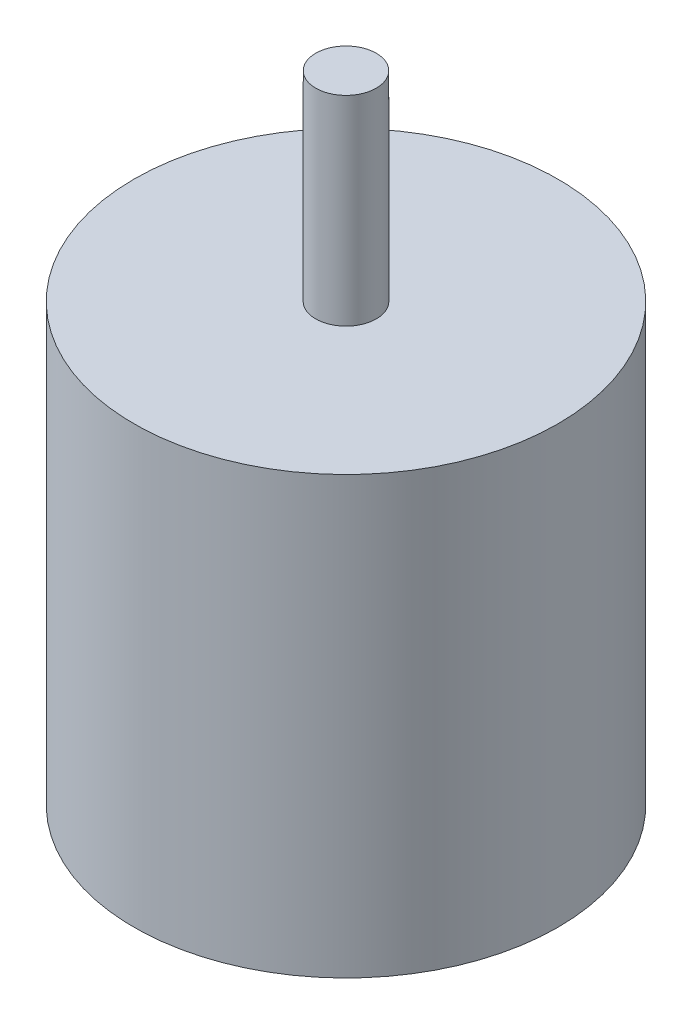
ISO-10303-21;
HEADER;
FILE_DESCRIPTION(('STEP AP214'),'2;1');
FILE_NAME('part.step','',(''),(''),'','','');
FILE_SCHEMA(('AUTOMOTIVE_DESIGN { 1 0 10303 214 1 1 1 1 }'));
ENDSEC;
DATA;
#1=APPLICATION_CONTEXT('core data for automotive mechanical design processes');
#2=APPLICATION_PROTOCOL_DEFINITION('international standard','automotive_design',2000,#1);
#3=PRODUCT_CONTEXT('',#1,'mechanical');
#4=PRODUCT('Part','Part','',(#3));
#5=PRODUCT_RELATED_PRODUCT_CATEGORY('part','',(#4));
#6=PRODUCT_DEFINITION_FORMATION('','',#4);
#7=PRODUCT_DEFINITION_CONTEXT('part definition',#1,'design');
#8=PRODUCT_DEFINITION('design','',#6,#7);
#9=PRODUCT_DEFINITION_SHAPE('','',#8);
#10=(LENGTH_UNIT() NAMED_UNIT(*) SI_UNIT(.MILLI.,.METRE.));
#11=(NAMED_UNIT(*) PLANE_ANGLE_UNIT() SI_UNIT($,.RADIAN.));
#12=(NAMED_UNIT(*) SI_UNIT($,.STERADIAN.) SOLID_ANGLE_UNIT());
#13=UNCERTAINTY_MEASURE_WITH_UNIT(LENGTH_MEASURE(1.E-05),#10,'distance_accuracy_value','');
#14=(GEOMETRIC_REPRESENTATION_CONTEXT(3) GLOBAL_UNCERTAINTY_ASSIGNED_CONTEXT((#13)) GLOBAL_UNIT_ASSIGNED_CONTEXT((#10,
#11,#12)) REPRESENTATION_CONTEXT('',''));
#15=CARTESIAN_POINT('',(0.,0.,0.));
#16=DIRECTION('',(0.,0.,1.));
#17=DIRECTION('',(1.,0.,0.));
#18=AXIS2_PLACEMENT_3D('',#15,#16,#17);
#19=CARTESIAN_POINT('',(0.,18.,0.));
#20=DIRECTION('',(0.,1.,0.));
#21=DIRECTION('',(-1.,0.,0.));
#22=AXIS2_PLACEMENT_3D('',#19,#20,#21);
#23=CYLINDRICAL_SURFACE('',#22,17.5);
#24=CARTESIAN_POINT('',(0.,18.,0.));
#25=DIRECTION('',(0.,1.,0.));
#26=DIRECTION('',(-1.,0.,0.));
#27=AXIS2_PLACEMENT_3D('',#24,#25,#26);
#28=CIRCLE('',#27,17.5);
#29=CARTESIAN_POINT('',(-17.5,18.,0.));
#30=VERTEX_POINT('',#29);
#31=EDGE_CURVE('E50',#30,#30,#28,.T.);
#32=ORIENTED_EDGE('',*,*,#31,.F.);
#33=EDGE_LOOP('',(#32));
#34=FACE_BOUND('',#33,.T.);
#35=CARTESIAN_POINT('',(0.,-18.,0.));
#36=DIRECTION('',(0.,1.,0.));
#37=DIRECTION('',(-1.,0.,0.));
#38=AXIS2_PLACEMENT_3D('',#35,#36,#37);
#39=CIRCLE('',#38,17.5);
#40=CARTESIAN_POINT('',(-17.5,-18.,0.));
#41=VERTEX_POINT('',#40);
#42=EDGE_CURVE('E55',#41,#41,#39,.T.);
#43=ORIENTED_EDGE('',*,*,#42,.T.);
#44=EDGE_LOOP('',(#43));
#45=FACE_BOUND('',#44,.T.);
#46=ADVANCED_FACE('F43',(#34,#45),#23,.T.);
#47=CARTESIAN_POINT('',(0.,18.,0.));
#48=DIRECTION('',(0.,-1.,0.));
#49=DIRECTION('',(1.,0.,0.));
#50=AXIS2_PLACEMENT_3D('',#47,#48,#49);
#51=PLANE('',#50);
#52=CARTESIAN_POINT('',(0.,18.,0.));
#53=DIRECTION('',(0.,-1.,0.));
#54=DIRECTION('',(1.,0.,0.));
#55=AXIS2_PLACEMENT_3D('',#52,#53,#54);
#56=CIRCLE('',#55,2.5);
#57=CARTESIAN_POINT('',(2.49999999999999,18.,0.));
#58=VERTEX_POINT('',#57);
#59=EDGE_CURVE('E10',#58,#58,#56,.F.);
#60=ORIENTED_EDGE('',*,*,#59,.F.);
#61=EDGE_LOOP('',(#60));
#62=FACE_BOUND('',#61,.T.);
#63=ORIENTED_EDGE('',*,*,#31,.T.);
#64=EDGE_LOOP('',(#63));
#65=FACE_BOUND('',#64,.T.);
#66=ADVANCED_FACE('F137',(#62,#65),#51,.F.);
#67=CARTESIAN_POINT('',(0.,-18.,0.));
#68=DIRECTION('',(0.,1.,0.));
#69=DIRECTION('',(-1.,0.,0.));
#70=AXIS2_PLACEMENT_3D('',#67,#68,#69);
#71=PLANE('',#70);
#72=CARTESIAN_POINT('',(0.,-18.,-9.5));
#73=DIRECTION('',(0.,-1.,0.));
#74=DIRECTION('',(1.,0.,0.));
#75=AXIS2_PLACEMENT_3D('',#72,#73,#74);
#76=CIRCLE('',#75,1.5);
#77=CARTESIAN_POINT('',(1.50000000000001,-18.,-9.5));
#78=VERTEX_POINT('',#77);
#79=EDGE_CURVE('E71',#78,#78,#76,.T.);
#80=ORIENTED_EDGE('',*,*,#79,.F.);
#81=EDGE_LOOP('',(#80));
#82=FACE_BOUND('',#81,.T.);
#83=CARTESIAN_POINT('',(12.5,-18.,0.));
#84=DIRECTION('',(0.,-1.,0.));
#85=DIRECTION('',(1.,0.,0.));
#86=AXIS2_PLACEMENT_3D('',#83,#84,#85);
#87=CIRCLE('',#86,1.5);
#88=CARTESIAN_POINT('',(14.,-18.,0.));
#89=VERTEX_POINT('',#88);
#90=EDGE_CURVE('E96',#89,#89,#87,.T.);
#91=ORIENTED_EDGE('',*,*,#90,.F.);
#92=EDGE_LOOP('',(#91));
#93=FACE_BOUND('',#92,.T.);
#94=CARTESIAN_POINT('',(-12.5,-18.,0.));
#95=DIRECTION('',(0.,-1.,0.));
#96=DIRECTION('',(1.,0.,0.));
#97=AXIS2_PLACEMENT_3D('',#94,#95,#96);
#98=CIRCLE('',#97,1.5);
#99=CARTESIAN_POINT('',(-11.,-18.,0.));
#100=VERTEX_POINT('',#99);
#101=EDGE_CURVE('E88',#100,#100,#98,.T.);
#102=ORIENTED_EDGE('',*,*,#101,.F.);
#103=EDGE_LOOP('',(#102));
#104=FACE_BOUND('',#103,.T.);
#105=CARTESIAN_POINT('',(-8.83883476483184,-18.,8.83883476483184));
#106=DIRECTION('',(0.,-1.,0.));
#107=DIRECTION('',(1.,0.,0.));
#108=AXIS2_PLACEMENT_3D('',#105,#106,#107);
#109=CIRCLE('',#108,4.);
#110=CARTESIAN_POINT('',(-4.83883476483184,-18.,8.83883476483184));
#111=VERTEX_POINT('',#110);
#112=EDGE_CURVE('E79',#111,#111,#109,.T.);
#113=ORIENTED_EDGE('',*,*,#112,.F.);
#114=EDGE_LOOP('',(#113));
#115=FACE_BOUND('',#114,.T.);
#116=CARTESIAN_POINT('',(8.83883476483185,-18.,-8.83883476483184));
#117=DIRECTION('',(0.,-1.,0.));
#118=DIRECTION('',(1.,0.,0.));
#119=AXIS2_PLACEMENT_3D('',#116,#117,#118);
#120=CIRCLE('',#119,4.);
#121=CARTESIAN_POINT('',(12.8388347648319,-18.,-8.83883476483184));
#122=VERTEX_POINT('',#121);
#123=EDGE_CURVE('E80',#122,#122,#120,.T.);
#124=ORIENTED_EDGE('',*,*,#123,.F.);
#125=EDGE_LOOP('',(#124));
#126=FACE_BOUND('',#125,.T.);
#127=CARTESIAN_POINT('',(-8.83883476483184,-18.,-8.83883476483184));
#128=DIRECTION('',(0.,-1.,0.));
#129=DIRECTION('',(1.,0.,0.));
#130=AXIS2_PLACEMENT_3D('',#127,#128,#129);
#131=CIRCLE('',#130,4.);
#132=CARTESIAN_POINT('',(-4.83883476483184,-18.,-8.83883476483184));
#133=VERTEX_POINT('',#132);
#134=EDGE_CURVE('E119',#133,#133,#131,.T.);
#135=ORIENTED_EDGE('',*,*,#134,.F.);
#136=EDGE_LOOP('',(#135));
#137=FACE_BOUND('',#136,.T.);
#138=CARTESIAN_POINT('',(8.83883476483185,-18.,8.83883476483184));
#139=DIRECTION('',(0.,-1.,0.));
#140=DIRECTION('',(1.,0.,0.));
#141=AXIS2_PLACEMENT_3D('',#138,#139,#140);
#142=CIRCLE('',#141,4.);
#143=CARTESIAN_POINT('',(12.8388347648319,-18.,8.83883476483184));
#144=VERTEX_POINT('',#143);
#145=EDGE_CURVE('E111',#144,#144,#142,.T.);
#146=ORIENTED_EDGE('',*,*,#145,.F.);
#147=EDGE_LOOP('',(#146));
#148=FACE_BOUND('',#147,.T.);
#149=CARTESIAN_POINT('',(0.,-18.,9.5));
#150=DIRECTION('',(0.,-1.,0.));
#151=DIRECTION('',(1.,0.,0.));
#152=AXIS2_PLACEMENT_3D('',#149,#150,#151);
#153=CIRCLE('',#152,1.5);
#154=CARTESIAN_POINT('',(1.50000000000001,-18.,9.5));
#155=VERTEX_POINT('',#154);
#156=EDGE_CURVE('E67',#155,#155,#153,.T.);
#157=ORIENTED_EDGE('',*,*,#156,.F.);
#158=EDGE_LOOP('',(#157));
#159=FACE_BOUND('',#158,.T.);
#160=ORIENTED_EDGE('',*,*,#42,.F.);
#161=EDGE_LOOP('',(#160));
#162=FACE_BOUND('',#161,.T.);
#163=ADVANCED_FACE('F133',(#82,#93,#104,#115,#126,#137,#148,#159,#162),#71,.F.);
#164=CARTESIAN_POINT('',(0.,34.5,0.));
#165=DIRECTION('',(0.,-1.,0.));
#166=DIRECTION('',(1.,0.,0.));
#167=AXIS2_PLACEMENT_3D('',#164,#165,#166);
#168=CYLINDRICAL_SURFACE('',#167,2.5);
#169=CARTESIAN_POINT('',(0.,34.5,0.));
#170=DIRECTION('',(0.,1.,0.));
#171=DIRECTION('',(-1.,0.,0.));
#172=AXIS2_PLACEMENT_3D('',#169,#170,#171);
#173=CIRCLE('',#172,2.5);
#174=CARTESIAN_POINT('',(-2.50000000000001,34.5,0.));
#175=VERTEX_POINT('',#174);
#176=EDGE_CURVE('E60',#175,#175,#173,.T.);
#177=ORIENTED_EDGE('',*,*,#176,.F.);
#178=EDGE_LOOP('',(#177));
#179=FACE_BOUND('',#178,.T.);
#180=ORIENTED_EDGE('',*,*,#59,.T.);
#181=EDGE_LOOP('',(#180));
#182=FACE_BOUND('',#181,.T.);
#183=ADVANCED_FACE('F136',(#179,#182),#168,.T.);
#184=CARTESIAN_POINT('',(0.,34.5,0.));
#185=DIRECTION('',(0.,1.,0.));
#186=DIRECTION('',(-1.,0.,0.));
#187=AXIS2_PLACEMENT_3D('',#184,#185,#186);
#188=PLANE('',#187);
#189=ORIENTED_EDGE('',*,*,#176,.T.);
#190=EDGE_LOOP('',(#189));
#191=FACE_BOUND('',#190,.T.);
#192=ADVANCED_FACE('F159',(#191),#188,.T.);
#193=CARTESIAN_POINT('',(0.,-13.,9.5));
#194=DIRECTION('',(0.,-1.,0.));
#195=DIRECTION('',(1.,0.,0.));
#196=AXIS2_PLACEMENT_3D('',#193,#194,#195);
#197=CYLINDRICAL_SURFACE('',#196,1.5);
#198=CARTESIAN_POINT('',(0.,-13.,9.5));
#199=DIRECTION('',(0.,-1.,0.));
#200=DIRECTION('',(1.,0.,0.));
#201=AXIS2_PLACEMENT_3D('',#198,#199,#200);
#202=CIRCLE('',#201,1.5);
#203=CARTESIAN_POINT('',(1.5,-13.,9.5));
#204=VERTEX_POINT('',#203);
#205=EDGE_CURVE('E66',#204,#204,#202,.T.);
#206=ORIENTED_EDGE('',*,*,#205,.F.);
#207=EDGE_LOOP('',(#206));
#208=FACE_BOUND('',#207,.T.);
#209=ORIENTED_EDGE('',*,*,#156,.T.);
#210=EDGE_LOOP('',(#209));
#211=FACE_BOUND('',#210,.T.);
#212=ADVANCED_FACE('F163',(#208,#211),#197,.F.);
#213=CARTESIAN_POINT('',(0.,-13.,9.5));
#214=DIRECTION('',(0.,-1.,0.));
#215=DIRECTION('',(1.,0.,0.));
#216=AXIS2_PLACEMENT_3D('',#213,#214,#215);
#217=PLANE('',#216);
#218=ORIENTED_EDGE('',*,*,#205,.T.);
#219=EDGE_LOOP('',(#218));
#220=FACE_BOUND('',#219,.T.);
#221=ADVANCED_FACE('F167',(#220),#217,.T.);
#222=CARTESIAN_POINT('',(8.83883476483185,-13.,8.83883476483184));
#223=DIRECTION('',(0.,-1.,0.));
#224=DIRECTION('',(1.,0.,0.));
#225=AXIS2_PLACEMENT_3D('',#222,#223,#224);
#226=CYLINDRICAL_SURFACE('',#225,4.);
#227=CARTESIAN_POINT('',(8.83883476483185,-13.,8.83883476483184));
#228=DIRECTION('',(0.,-1.,0.));
#229=DIRECTION('',(1.,0.,0.));
#230=AXIS2_PLACEMENT_3D('',#227,#228,#229);
#231=CIRCLE('',#230,4.);
#232=CARTESIAN_POINT('',(12.8388347648318,-13.,8.83883476483184));
#233=VERTEX_POINT('',#232);
#234=EDGE_CURVE('E107',#233,#233,#231,.T.);
#235=ORIENTED_EDGE('',*,*,#234,.F.);
#236=EDGE_LOOP('',(#235));
#237=FACE_BOUND('',#236,.T.);
#238=ORIENTED_EDGE('',*,*,#145,.T.);
#239=EDGE_LOOP('',(#238));
#240=FACE_BOUND('',#239,.T.);
#241=ADVANCED_FACE('F171',(#237,#240),#226,.F.);
#242=CARTESIAN_POINT('',(8.83883476483185,-13.,8.83883476483184));
#243=DIRECTION('',(0.,-1.,0.));
#244=DIRECTION('',(1.,0.,0.));
#245=AXIS2_PLACEMENT_3D('',#242,#243,#244);
#246=PLANE('',#245);
#247=ORIENTED_EDGE('',*,*,#234,.T.);
#248=EDGE_LOOP('',(#247));
#249=FACE_BOUND('',#248,.T.);
#250=ADVANCED_FACE('F206',(#249),#246,.T.);
#251=CARTESIAN_POINT('',(-8.83883476483184,-13.,-8.83883476483184));
#252=DIRECTION('',(0.,-1.,0.));
#253=DIRECTION('',(1.,0.,0.));
#254=AXIS2_PLACEMENT_3D('',#251,#252,#253);
#255=CYLINDRICAL_SURFACE('',#254,4.);
#256=CARTESIAN_POINT('',(-8.83883476483184,-13.,-8.83883476483184));
#257=DIRECTION('',(0.,-1.,0.));
#258=DIRECTION('',(1.,0.,0.));
#259=AXIS2_PLACEMENT_3D('',#256,#257,#258);
#260=CIRCLE('',#259,4.);
#261=CARTESIAN_POINT('',(-4.83883476483184,-13.,-8.83883476483184));
#262=VERTEX_POINT('',#261);
#263=EDGE_CURVE('E115',#262,#262,#260,.T.);
#264=ORIENTED_EDGE('',*,*,#263,.F.);
#265=EDGE_LOOP('',(#264));
#266=FACE_BOUND('',#265,.T.);
#267=ORIENTED_EDGE('',*,*,#134,.T.);
#268=EDGE_LOOP('',(#267));
#269=FACE_BOUND('',#268,.T.);
#270=ADVANCED_FACE('F209',(#266,#269),#255,.F.);
#271=CARTESIAN_POINT('',(-8.83883476483184,-13.,-8.83883476483184));
#272=DIRECTION('',(0.,-1.,0.));
#273=DIRECTION('',(1.,0.,0.));
#274=AXIS2_PLACEMENT_3D('',#271,#272,#273);
#275=PLANE('',#274);
#276=ORIENTED_EDGE('',*,*,#263,.T.);
#277=EDGE_LOOP('',(#276));
#278=FACE_BOUND('',#277,.T.);
#279=ADVANCED_FACE('F214',(#278),#275,.T.);
#280=CARTESIAN_POINT('',(8.83883476483185,-13.,-8.83883476483184));
#281=DIRECTION('',(0.,-1.,0.));
#282=DIRECTION('',(1.,0.,0.));
#283=AXIS2_PLACEMENT_3D('',#280,#281,#282);
#284=CYLINDRICAL_SURFACE('',#283,4.);
#285=CARTESIAN_POINT('',(8.83883476483185,-13.,-8.83883476483184));
#286=DIRECTION('',(0.,-1.,0.));
#287=DIRECTION('',(1.,0.,0.));
#288=AXIS2_PLACEMENT_3D('',#285,#286,#287);
#289=CIRCLE('',#288,4.);
#290=CARTESIAN_POINT('',(12.8388347648319,-13.,-8.83883476483184));
#291=VERTEX_POINT('',#290);
#292=EDGE_CURVE('E123',#291,#291,#289,.T.);
#293=ORIENTED_EDGE('',*,*,#292,.F.);
#294=EDGE_LOOP('',(#293));
#295=FACE_BOUND('',#294,.T.);
#296=ORIENTED_EDGE('',*,*,#123,.T.);
#297=EDGE_LOOP('',(#296));
#298=FACE_BOUND('',#297,.T.);
#299=ADVANCED_FACE('F131',(#295,#298),#284,.F.);
#300=CARTESIAN_POINT('',(8.83883476483185,-13.,-8.83883476483184));
#301=DIRECTION('',(0.,-1.,0.));
#302=DIRECTION('',(1.,0.,0.));
#303=AXIS2_PLACEMENT_3D('',#300,#301,#302);
#304=PLANE('',#303);
#305=ORIENTED_EDGE('',*,*,#292,.T.);
#306=EDGE_LOOP('',(#305));
#307=FACE_BOUND('',#306,.T.);
#308=ADVANCED_FACE('F181',(#307),#304,.T.);
#309=CARTESIAN_POINT('',(-8.83883476483184,-13.,8.83883476483184));
#310=DIRECTION('',(0.,-1.,0.));
#311=DIRECTION('',(1.,0.,0.));
#312=AXIS2_PLACEMENT_3D('',#309,#310,#311);
#313=CYLINDRICAL_SURFACE('',#312,4.);
#314=CARTESIAN_POINT('',(-8.83883476483184,-13.,8.83883476483184));
#315=DIRECTION('',(0.,-1.,0.));
#316=DIRECTION('',(1.,0.,0.));
#317=AXIS2_PLACEMENT_3D('',#314,#315,#316);
#318=CIRCLE('',#317,4.);
#319=CARTESIAN_POINT('',(-4.83883476483184,-13.,8.83883476483184));
#320=VERTEX_POINT('',#319);
#321=EDGE_CURVE('E75',#320,#320,#318,.T.);
#322=ORIENTED_EDGE('',*,*,#321,.F.);
#323=EDGE_LOOP('',(#322));
#324=FACE_BOUND('',#323,.T.);
#325=ORIENTED_EDGE('',*,*,#112,.T.);
#326=EDGE_LOOP('',(#325));
#327=FACE_BOUND('',#326,.T.);
#328=ADVANCED_FACE('F177',(#324,#327),#313,.F.);
#329=CARTESIAN_POINT('',(-8.83883476483184,-13.,8.83883476483184));
#330=DIRECTION('',(0.,-1.,0.));
#331=DIRECTION('',(1.,0.,0.));
#332=AXIS2_PLACEMENT_3D('',#329,#330,#331);
#333=PLANE('',#332);
#334=ORIENTED_EDGE('',*,*,#321,.T.);
#335=EDGE_LOOP('',(#334));
#336=FACE_BOUND('',#335,.T.);
#337=ADVANCED_FACE('F173',(#336),#333,.T.);
#338=CARTESIAN_POINT('',(-12.5,-13.,0.));
#339=DIRECTION('',(0.,-1.,0.));
#340=DIRECTION('',(1.,0.,0.));
#341=AXIS2_PLACEMENT_3D('',#338,#339,#340);
#342=CYLINDRICAL_SURFACE('',#341,1.5);
#343=CARTESIAN_POINT('',(-12.5,-13.,0.));
#344=DIRECTION('',(0.,-1.,0.));
#345=DIRECTION('',(1.,0.,0.));
#346=AXIS2_PLACEMENT_3D('',#343,#344,#345);
#347=CIRCLE('',#346,1.5);
#348=CARTESIAN_POINT('',(-11.,-13.,0.));
#349=VERTEX_POINT('',#348);
#350=EDGE_CURVE('E84',#349,#349,#347,.T.);
#351=ORIENTED_EDGE('',*,*,#350,.F.);
#352=EDGE_LOOP('',(#351));
#353=FACE_BOUND('',#352,.T.);
#354=ORIENTED_EDGE('',*,*,#101,.T.);
#355=EDGE_LOOP('',(#354));
#356=FACE_BOUND('',#355,.T.);
#357=ADVANCED_FACE('F176',(#353,#356),#342,.F.);
#358=CARTESIAN_POINT('',(-12.5,-13.,0.));
#359=DIRECTION('',(0.,-1.,0.));
#360=DIRECTION('',(1.,0.,0.));
#361=AXIS2_PLACEMENT_3D('',#358,#359,#360);
#362=PLANE('',#361);
#363=ORIENTED_EDGE('',*,*,#350,.T.);
#364=EDGE_LOOP('',(#363));
#365=FACE_BOUND('',#364,.T.);
#366=ADVANCED_FACE('F183',(#365),#362,.T.);
#367=CARTESIAN_POINT('',(12.5,-13.,0.));
#368=DIRECTION('',(0.,-1.,0.));
#369=DIRECTION('',(1.,0.,0.));
#370=AXIS2_PLACEMENT_3D('',#367,#368,#369);
#371=CYLINDRICAL_SURFACE('',#370,1.5);
#372=CARTESIAN_POINT('',(12.5,-13.,0.));
#373=DIRECTION('',(0.,-1.,0.));
#374=DIRECTION('',(1.,0.,0.));
#375=AXIS2_PLACEMENT_3D('',#372,#373,#374);
#376=CIRCLE('',#375,1.5);
#377=CARTESIAN_POINT('',(14.,-13.,0.));
#378=VERTEX_POINT('',#377);
#379=EDGE_CURVE('E92',#378,#378,#376,.T.);
#380=ORIENTED_EDGE('',*,*,#379,.F.);
#381=EDGE_LOOP('',(#380));
#382=FACE_BOUND('',#381,.T.);
#383=ORIENTED_EDGE('',*,*,#90,.T.);
#384=EDGE_LOOP('',(#383));
#385=FACE_BOUND('',#384,.T.);
#386=ADVANCED_FACE('F186',(#382,#385),#371,.F.);
#387=CARTESIAN_POINT('',(12.5,-13.,0.));
#388=DIRECTION('',(0.,-1.,0.));
#389=DIRECTION('',(1.,0.,0.));
#390=AXIS2_PLACEMENT_3D('',#387,#388,#389);
#391=PLANE('',#390);
#392=ORIENTED_EDGE('',*,*,#379,.T.);
#393=EDGE_LOOP('',(#392));
#394=FACE_BOUND('',#393,.T.);
#395=ADVANCED_FACE('F191',(#394),#391,.T.);
#396=CARTESIAN_POINT('',(0.,-13.,-9.5));
#397=DIRECTION('',(0.,-1.,0.));
#398=DIRECTION('',(1.,0.,0.));
#399=AXIS2_PLACEMENT_3D('',#396,#397,#398);
#400=CYLINDRICAL_SURFACE('',#399,1.5);
#401=CARTESIAN_POINT('',(0.,-13.,-9.5));
#402=DIRECTION('',(0.,-1.,0.));
#403=DIRECTION('',(1.,0.,0.));
#404=AXIS2_PLACEMENT_3D('',#401,#402,#403);
#405=CIRCLE('',#404,1.5);
#406=CARTESIAN_POINT('',(1.5,-13.,-9.5));
#407=VERTEX_POINT('',#406);
#408=EDGE_CURVE('E100',#407,#407,#405,.T.);
#409=ORIENTED_EDGE('',*,*,#408,.F.);
#410=EDGE_LOOP('',(#409));
#411=FACE_BOUND('',#410,.T.);
#412=ORIENTED_EDGE('',*,*,#79,.T.);
#413=EDGE_LOOP('',(#412));
#414=FACE_BOUND('',#413,.T.);
#415=ADVANCED_FACE('F194',(#411,#414),#400,.F.);
#416=CARTESIAN_POINT('',(0.,-13.,-9.5));
#417=DIRECTION('',(0.,-1.,0.));
#418=DIRECTION('',(1.,0.,0.));
#419=AXIS2_PLACEMENT_3D('',#416,#417,#418);
#420=PLANE('',#419);
#421=ORIENTED_EDGE('',*,*,#408,.T.);
#422=EDGE_LOOP('',(#421));
#423=FACE_BOUND('',#422,.T.);
#424=ADVANCED_FACE('F199',(#423),#420,.T.);
#425=CLOSED_SHELL('',(#46,#66,#163,#183,#192,#212,#221,#241,#250,#270,#279,#299,#308,#328,#337,
#357,#366,#386,#395,#415,#424));
#426=MANIFOLD_SOLID_BREP('B2',#425);
#427=ADVANCED_BREP_SHAPE_REPRESENTATION('',(#18,#426),#14);
#428=SHAPE_DEFINITION_REPRESENTATION(#9,#427);
ENDSEC;
END-ISO-10303-21;
